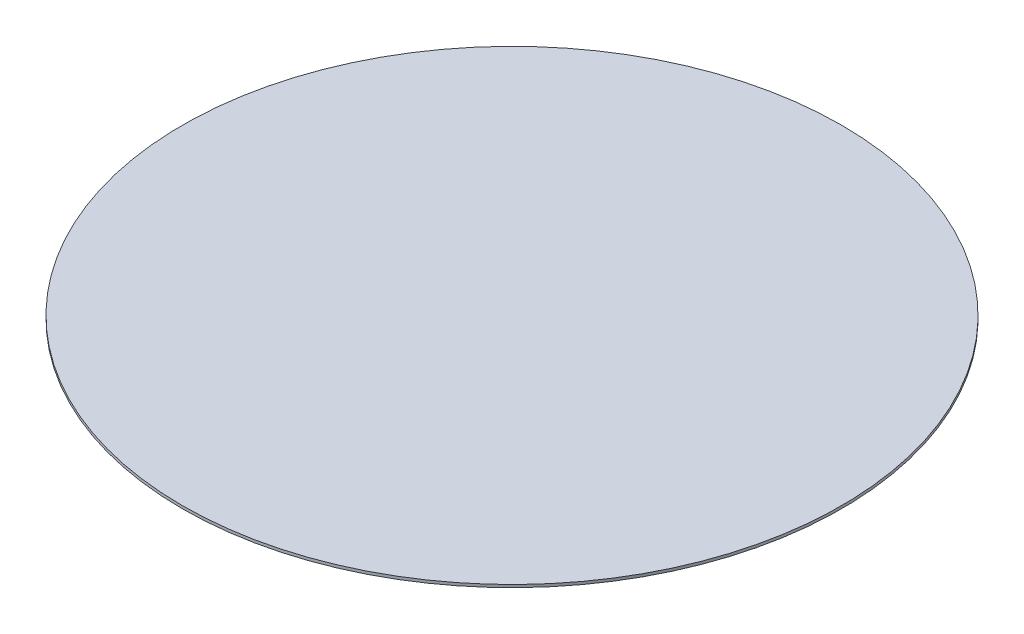
ISO-10303-21;
HEADER;
FILE_DESCRIPTION(('STEP AP214'),'2;1');
FILE_NAME('part.step','',(''),(''),'','','');
FILE_SCHEMA(('AUTOMOTIVE_DESIGN { 1 0 10303 214 1 1 1 1 }'));
ENDSEC;
DATA;
#1=APPLICATION_CONTEXT('core data for automotive mechanical design processes');
#2=APPLICATION_PROTOCOL_DEFINITION('international standard','automotive_design',2000,#1);
#3=PRODUCT_CONTEXT('',#1,'mechanical');
#4=PRODUCT('Part','Part','',(#3));
#5=PRODUCT_RELATED_PRODUCT_CATEGORY('part','',(#4));
#6=PRODUCT_DEFINITION_FORMATION('','',#4);
#7=PRODUCT_DEFINITION_CONTEXT('part definition',#1,'design');
#8=PRODUCT_DEFINITION('design','',#6,#7);
#9=PRODUCT_DEFINITION_SHAPE('','',#8);
#10=(LENGTH_UNIT() NAMED_UNIT(*) SI_UNIT(.MILLI.,.METRE.));
#11=(NAMED_UNIT(*) PLANE_ANGLE_UNIT() SI_UNIT($,.RADIAN.));
#12=(NAMED_UNIT(*) SI_UNIT($,.STERADIAN.) SOLID_ANGLE_UNIT());
#13=UNCERTAINTY_MEASURE_WITH_UNIT(LENGTH_MEASURE(1.E-05),#10,'distance_accuracy_value','');
#14=(GEOMETRIC_REPRESENTATION_CONTEXT(3) GLOBAL_UNCERTAINTY_ASSIGNED_CONTEXT((#13)) GLOBAL_UNIT_ASSIGNED_CONTEXT((#10,
#11,#12)) REPRESENTATION_CONTEXT('',''));
#15=CARTESIAN_POINT('',(0.,0.,0.));
#16=DIRECTION('',(0.,0.,1.));
#17=DIRECTION('',(1.,0.,0.));
#18=AXIS2_PLACEMENT_3D('',#15,#16,#17);
#19=CARTESIAN_POINT('',(0.,0.79375,0.));
#20=DIRECTION('',(0.,-1.,0.));
#21=DIRECTION('',(0.,0.,-1.));
#22=AXIS2_PLACEMENT_3D('',#19,#20,#21);
#23=CYLINDRICAL_SURFACE('',#22,95.25);
#24=CARTESIAN_POINT('',(0.,0.79375,0.));
#25=DIRECTION('',(0.,1.,0.));
#26=DIRECTION('',(0.,0.,1.));
#27=AXIS2_PLACEMENT_3D('',#24,#25,#26);
#28=CIRCLE('',#27,95.25);
#29=CARTESIAN_POINT('',(0.,0.79375,95.25));
#30=VERTEX_POINT('',#29);
#31=EDGE_CURVE('E10',#30,#30,#28,.T.);
#32=ORIENTED_EDGE('',*,*,#31,.F.);
#33=EDGE_LOOP('',(#32));
#34=FACE_BOUND('',#33,.T.);
#35=CARTESIAN_POINT('',(0.,0.,0.));
#36=DIRECTION('',(0.,1.,0.));
#37=DIRECTION('',(0.,0.,1.));
#38=AXIS2_PLACEMENT_3D('',#35,#36,#37);
#39=CIRCLE('',#38,95.25);
#40=CARTESIAN_POINT('',(0.,0.,95.25));
#41=VERTEX_POINT('',#40);
#42=EDGE_CURVE('E34',#41,#41,#39,.T.);
#43=ORIENTED_EDGE('',*,*,#42,.T.);
#44=EDGE_LOOP('',(#43));
#45=FACE_BOUND('',#44,.T.);
#46=ADVANCED_FACE('F31',(#34,#45),#23,.T.);
#47=CARTESIAN_POINT('',(0.,0.79375,0.));
#48=DIRECTION('',(0.,1.,0.));
#49=DIRECTION('',(0.,0.,1.));
#50=AXIS2_PLACEMENT_3D('',#47,#48,#49);
#51=PLANE('',#50);
#52=ORIENTED_EDGE('',*,*,#31,.T.);
#53=EDGE_LOOP('',(#52));
#54=FACE_BOUND('',#53,.T.);
#55=ADVANCED_FACE('F46',(#54),#51,.T.);
#56=CARTESIAN_POINT('',(0.,0.,0.));
#57=DIRECTION('',(0.,1.,0.));
#58=DIRECTION('',(0.,0.,1.));
#59=AXIS2_PLACEMENT_3D('',#56,#57,#58);
#60=PLANE('',#59);
#61=ORIENTED_EDGE('',*,*,#42,.F.);
#62=EDGE_LOOP('',(#61));
#63=FACE_BOUND('',#62,.T.);
#64=ADVANCED_FACE('F44',(#63),#60,.F.);
#65=CLOSED_SHELL('',(#46,#55,#64));
#66=MANIFOLD_SOLID_BREP('B2',#65);
#67=ADVANCED_BREP_SHAPE_REPRESENTATION('',(#18,#66),#14);
#68=SHAPE_DEFINITION_REPRESENTATION(#9,#67);
ENDSEC;
END-ISO-10303-21;
